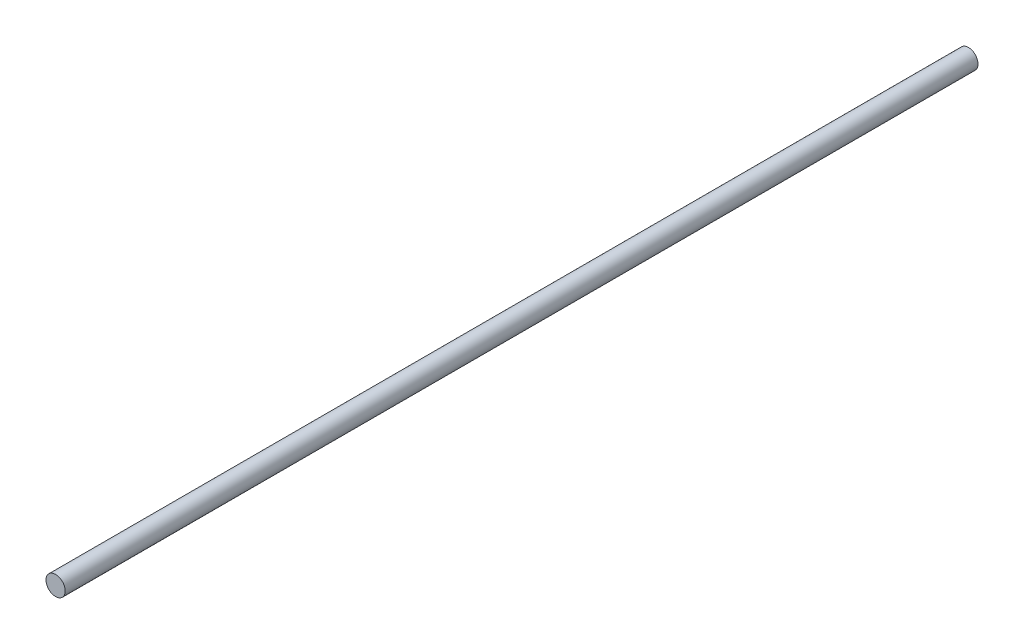
ISO-10303-21;
HEADER;
FILE_DESCRIPTION(('STEP AP214'),'2;1');
FILE_NAME('part.step','',(''),(''),'','','');
FILE_SCHEMA(('AUTOMOTIVE_DESIGN { 1 0 10303 214 1 1 1 1 }'));
ENDSEC;
DATA;
#1=APPLICATION_CONTEXT('core data for automotive mechanical design processes');
#2=APPLICATION_PROTOCOL_DEFINITION('international standard','automotive_design',2000,#1);
#3=PRODUCT_CONTEXT('',#1,'mechanical');
#4=PRODUCT('Part','Part','',(#3));
#5=PRODUCT_RELATED_PRODUCT_CATEGORY('part','',(#4));
#6=PRODUCT_DEFINITION_FORMATION('','',#4);
#7=PRODUCT_DEFINITION_CONTEXT('part definition',#1,'design');
#8=PRODUCT_DEFINITION('design','',#6,#7);
#9=PRODUCT_DEFINITION_SHAPE('','',#8);
#10=(LENGTH_UNIT() NAMED_UNIT(*) SI_UNIT(.MILLI.,.METRE.));
#11=(NAMED_UNIT(*) PLANE_ANGLE_UNIT() SI_UNIT($,.RADIAN.));
#12=(NAMED_UNIT(*) SI_UNIT($,.STERADIAN.) SOLID_ANGLE_UNIT());
#13=UNCERTAINTY_MEASURE_WITH_UNIT(LENGTH_MEASURE(1.E-05),#10,'distance_accuracy_value','');
#14=(GEOMETRIC_REPRESENTATION_CONTEXT(3) GLOBAL_UNCERTAINTY_ASSIGNED_CONTEXT((#13)) GLOBAL_UNIT_ASSIGNED_CONTEXT((#10,
#11,#12)) REPRESENTATION_CONTEXT('',''));
#15=CARTESIAN_POINT('',(0.,0.,0.));
#16=DIRECTION('',(0.,0.,1.));
#17=DIRECTION('',(1.,0.,0.));
#18=AXIS2_PLACEMENT_3D('',#15,#16,#17);
#19=CARTESIAN_POINT('',(0.,0.,950.));
#20=DIRECTION('',(0.,0.,-1.));
#21=DIRECTION('',(-1.,0.,0.));
#22=AXIS2_PLACEMENT_3D('',#19,#20,#21);
#23=CYLINDRICAL_SURFACE('',#22,10.);
#24=CARTESIAN_POINT('',(0.,0.,950.));
#25=DIRECTION('',(0.,0.,1.));
#26=DIRECTION('',(1.,0.,0.));
#27=AXIS2_PLACEMENT_3D('',#24,#25,#26);
#28=CIRCLE('',#27,10.);
#29=CARTESIAN_POINT('',(-10.,0.,950.));
#30=VERTEX_POINT('',#29);
#31=EDGE_CURVE('E10',#30,#30,#28,.T.);
#32=CARTESIAN_POINT('',(0.,0.,0.));
#33=DIRECTION('',(0.,0.,1.));
#34=DIRECTION('',(1.,0.,0.));
#35=AXIS2_PLACEMENT_3D('',#32,#33,#34);
#36=CIRCLE('',#35,10.);
#37=CARTESIAN_POINT('',(-10.,0.,-1.11022302462516E-13));
#38=VERTEX_POINT('',#37);
#39=EDGE_CURVE('E33',#38,#38,#36,.T.);
#40=CARTESIAN_POINT('',(-10.,0.,950.));
#41=CARTESIAN_POINT('',(-10.,0.,940.104166666667));
#42=CARTESIAN_POINT('',(-10.,0.,930.208333333333));
#43=CARTESIAN_POINT('',(-10.,0.,910.416666666667));
#44=CARTESIAN_POINT('',(-10.,0.,900.520833333333));
#45=CARTESIAN_POINT('',(-10.,0.,880.729166666667));
#46=CARTESIAN_POINT('',(-10.,0.,870.833333333333));
#47=CARTESIAN_POINT('',(-10.,0.,851.041666666667));
#48=CARTESIAN_POINT('',(-10.,0.,841.145833333333));
#49=CARTESIAN_POINT('',(-10.,0.,821.354166666667));
#50=CARTESIAN_POINT('',(-10.,0.,811.458333333333));
#51=CARTESIAN_POINT('',(-10.,0.,791.666666666667));
#52=CARTESIAN_POINT('',(-10.,0.,781.770833333333));
#53=CARTESIAN_POINT('',(-10.,0.,761.979166666667));
#54=CARTESIAN_POINT('',(-10.,0.,752.083333333333));
#55=CARTESIAN_POINT('',(-10.,0.,732.291666666667));
#56=CARTESIAN_POINT('',(-10.,0.,722.395833333333));
#57=CARTESIAN_POINT('',(-10.,0.,702.604166666667));
#58=CARTESIAN_POINT('',(-10.,0.,692.708333333333));
#59=CARTESIAN_POINT('',(-10.,0.,672.916666666667));
#60=CARTESIAN_POINT('',(-10.,0.,663.020833333333));
#61=CARTESIAN_POINT('',(-10.,0.,643.229166666667));
#62=CARTESIAN_POINT('',(-10.,0.,633.333333333333));
#63=CARTESIAN_POINT('',(-10.,0.,613.541666666667));
#64=CARTESIAN_POINT('',(-10.,0.,603.645833333333));
#65=CARTESIAN_POINT('',(-10.,0.,583.854166666667));
#66=CARTESIAN_POINT('',(-10.,0.,573.958333333333));
#67=CARTESIAN_POINT('',(-10.,0.,554.166666666667));
#68=CARTESIAN_POINT('',(-10.,0.,544.270833333333));
#69=CARTESIAN_POINT('',(-10.,0.,524.479166666667));
#70=CARTESIAN_POINT('',(-10.,0.,514.583333333333));
#71=CARTESIAN_POINT('',(-10.,0.,494.791666666667));
#72=CARTESIAN_POINT('',(-10.,0.,484.895833333333));
#73=CARTESIAN_POINT('',(-10.,0.,465.104166666667));
#74=CARTESIAN_POINT('',(-10.,0.,455.208333333333));
#75=CARTESIAN_POINT('',(-10.,0.,435.416666666667));
#76=CARTESIAN_POINT('',(-10.,0.,425.520833333333));
#77=CARTESIAN_POINT('',(-10.,0.,405.729166666667));
#78=CARTESIAN_POINT('',(-10.,0.,395.833333333333));
#79=CARTESIAN_POINT('',(-10.,0.,376.041666666667));
#80=CARTESIAN_POINT('',(-10.,0.,366.145833333333));
#81=CARTESIAN_POINT('',(-10.,0.,346.354166666667));
#82=CARTESIAN_POINT('',(-10.,0.,336.458333333333));
#83=CARTESIAN_POINT('',(-10.,0.,316.666666666667));
#84=CARTESIAN_POINT('',(-10.,0.,306.770833333333));
#85=CARTESIAN_POINT('',(-10.,0.,286.979166666667));
#86=CARTESIAN_POINT('',(-10.,0.,277.083333333333));
#87=CARTESIAN_POINT('',(-10.,0.,257.291666666667));
#88=CARTESIAN_POINT('',(-10.,0.,247.395833333333));
#89=CARTESIAN_POINT('',(-10.,0.,227.604166666667));
#90=CARTESIAN_POINT('',(-10.,0.,217.708333333333));
#91=CARTESIAN_POINT('',(-10.,0.,197.916666666667));
#92=CARTESIAN_POINT('',(-10.,0.,188.020833333333));
#93=CARTESIAN_POINT('',(-10.,0.,168.229166666667));
#94=CARTESIAN_POINT('',(-10.,0.,158.333333333333));
#95=CARTESIAN_POINT('',(-10.,0.,138.541666666667));
#96=CARTESIAN_POINT('',(-10.,0.,128.645833333333));
#97=CARTESIAN_POINT('',(-10.,0.,108.854166666667));
#98=CARTESIAN_POINT('',(-10.,0.,98.9583333333333));
#99=CARTESIAN_POINT('',(-10.,0.,79.1666666666666));
#100=CARTESIAN_POINT('',(-10.,0.,69.2708333333332));
#101=CARTESIAN_POINT('',(-10.,0.,49.4791666666665));
#102=CARTESIAN_POINT('',(-10.,0.,39.5833333333332));
#103=CARTESIAN_POINT('',(-10.,0.,19.7916666666665));
#104=CARTESIAN_POINT('',(-10.,0.,9.89583333333321));
#105=CARTESIAN_POINT('',(-10.,0.,-1.11022302462516E-13));
#106=B_SPLINE_CURVE_WITH_KNOTS('',3,(#40,#41,#42,#43,#44,#45,#46,#47,#48,#49,#50,#51,#52,#53,
#54,#55,#56,#57,#58,#59,#60,#61,#62,#63,#64,#65,#66,#67,#68,#69,#70,#71,#72,#73,#74,#75,#76,#77,
#78,#79,#80,#81,#82,#83,#84,#85,#86,#87,#88,#89,#90,#91,#92,#93,#94,#95,#96,#97,#98,#99,#100,
#101,#102,#103,#104,#105),.UNSPECIFIED.,.F.,.F.,(4,2,2,2,2,2,2,2,2,2,2,2,2,2,2,2,2,2,2,2,2,2,2,
2,2,2,2,2,2,2,2,2,4),(0.,29.6875000000001,59.3750000000001,89.0625,118.75,148.4375,178.125,
207.8125,237.5,267.1875,296.875,326.5625,356.25,385.9375,415.625,445.3125,475.,504.6875,534.375,
564.0625,593.75,623.4375,653.125,682.8125,712.5,742.1875,771.875,801.5625,831.25,860.9375,
890.625,920.3125,950.),.UNSPECIFIED.);
#107=EDGE_CURVE('BSEAM30',#30,#38,#106,.T.);
#108=ORIENTED_EDGE('',*,*,#31,.F.);
#109=ORIENTED_EDGE('',*,*,#39,.T.);
#110=ORIENTED_EDGE('',*,*,#107,.T.);
#111=ORIENTED_EDGE('',*,*,#107,.F.);
#112=EDGE_LOOP('',(#108,#110,#109,#111));
#113=FACE_BOUND('',#112,.T.);
#114=ADVANCED_FACE('F30',(#113),#23,.T.);
#115=CARTESIAN_POINT('',(0.,0.,950.));
#116=DIRECTION('',(0.,0.,1.));
#117=DIRECTION('',(1.,0.,0.));
#118=AXIS2_PLACEMENT_3D('',#115,#116,#117);
#119=PLANE('',#118);
#120=ORIENTED_EDGE('',*,*,#31,.T.);
#121=EDGE_LOOP('',(#120));
#122=FACE_BOUND('',#121,.T.);
#123=ADVANCED_FACE('F45',(#122),#119,.T.);
#124=CARTESIAN_POINT('',(0.,0.,0.));
#125=DIRECTION('',(0.,0.,1.));
#126=DIRECTION('',(1.,0.,0.));
#127=AXIS2_PLACEMENT_3D('',#124,#125,#126);
#128=PLANE('',#127);
#129=ORIENTED_EDGE('',*,*,#39,.F.);
#130=EDGE_LOOP('',(#129));
#131=FACE_BOUND('',#130,.T.);
#132=ADVANCED_FACE('F43',(#131),#128,.F.);
#133=CLOSED_SHELL('',(#114,#123,#132));
#134=MANIFOLD_SOLID_BREP('B2',#133);
#135=ADVANCED_BREP_SHAPE_REPRESENTATION('',(#18,#134),#14);
#136=SHAPE_DEFINITION_REPRESENTATION(#9,#135);
ENDSEC;
END-ISO-10303-21;
